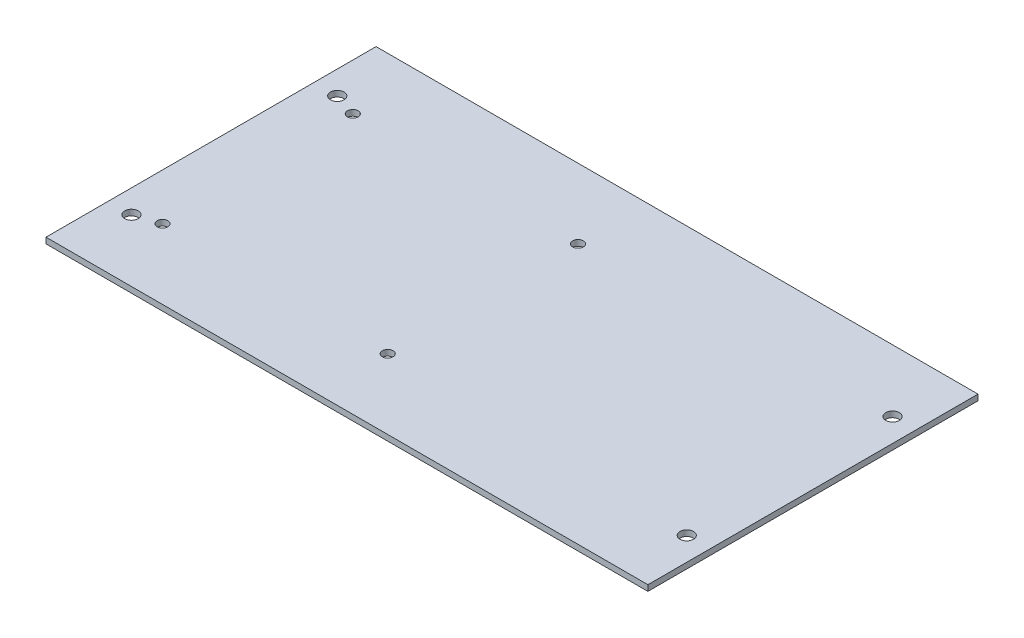
ISO-10303-21;
HEADER;
FILE_DESCRIPTION(('STEP AP214'),'2;1');
FILE_NAME('part.step','',(''),(''),'','','');
FILE_SCHEMA(('AUTOMOTIVE_DESIGN { 1 0 10303 214 1 1 1 1 }'));
ENDSEC;
DATA;
#1=APPLICATION_CONTEXT('core data for automotive mechanical design processes');
#2=APPLICATION_PROTOCOL_DEFINITION('international standard','automotive_design',2000,#1);
#3=PRODUCT_CONTEXT('',#1,'mechanical');
#4=PRODUCT('Part','Part','',(#3));
#5=PRODUCT_RELATED_PRODUCT_CATEGORY('part','',(#4));
#6=PRODUCT_DEFINITION_FORMATION('','',#4);
#7=PRODUCT_DEFINITION_CONTEXT('part definition',#1,'design');
#8=PRODUCT_DEFINITION('design','',#6,#7);
#9=PRODUCT_DEFINITION_SHAPE('','',#8);
#10=(LENGTH_UNIT() NAMED_UNIT(*) SI_UNIT(.MILLI.,.METRE.));
#11=(NAMED_UNIT(*) PLANE_ANGLE_UNIT() SI_UNIT($,.RADIAN.));
#12=(NAMED_UNIT(*) SI_UNIT($,.STERADIAN.) SOLID_ANGLE_UNIT());
#13=UNCERTAINTY_MEASURE_WITH_UNIT(LENGTH_MEASURE(1.E-05),#10,'distance_accuracy_value','');
#14=(GEOMETRIC_REPRESENTATION_CONTEXT(3) GLOBAL_UNCERTAINTY_ASSIGNED_CONTEXT((#13)) GLOBAL_UNIT_ASSIGNED_CONTEXT((#10,
#11,#12)) REPRESENTATION_CONTEXT('',''));
#15=CARTESIAN_POINT('',(0.,0.,0.));
#16=DIRECTION('',(0.,0.,1.));
#17=DIRECTION('',(1.,0.,0.));
#18=AXIS2_PLACEMENT_3D('',#15,#16,#17);
#19=CARTESIAN_POINT('',(-77.5,1.5,42.5));
#20=DIRECTION('',(1.,0.,0.));
#21=DIRECTION('',(0.,0.,-1.));
#22=AXIS2_PLACEMENT_3D('',#19,#20,#21);
#23=PLANE('',#22);
#24=DIRECTION('',(0.,0.,1.));
#25=VECTOR('',#24,1.);
#26=CARTESIAN_POINT('',(-77.5,0.,42.5));
#27=LINE('',#26,#25);
#28=CARTESIAN_POINT('',(-77.5,0.,-42.5));
#29=VERTEX_POINT('',#28);
#30=CARTESIAN_POINT('',(-77.5,0.,42.5));
#31=VERTEX_POINT('',#30);
#32=EDGE_CURVE('E101',#29,#31,#27,.T.);
#33=ORIENTED_EDGE('',*,*,#32,.T.);
#34=DIRECTION('',(0.,-1.,0.));
#35=VECTOR('',#34,1.);
#36=CARTESIAN_POINT('',(-77.5,1.5,42.5));
#37=LINE('',#36,#35);
#38=CARTESIAN_POINT('',(-77.5,1.5,42.5));
#39=VERTEX_POINT('',#38);
#40=EDGE_CURVE('E11',#39,#31,#37,.T.);
#41=ORIENTED_EDGE('',*,*,#40,.F.);
#42=DIRECTION('',(0.,0.,1.));
#43=VECTOR('',#42,1.);
#44=CARTESIAN_POINT('',(-77.5,1.5,42.5));
#45=LINE('',#44,#43);
#46=CARTESIAN_POINT('',(-77.5,1.5,-42.5));
#47=VERTEX_POINT('',#46);
#48=EDGE_CURVE('E88',#47,#39,#45,.T.);
#49=ORIENTED_EDGE('',*,*,#48,.F.);
#50=DIRECTION('',(0.,-1.,0.));
#51=VECTOR('',#50,1.);
#52=CARTESIAN_POINT('',(-77.5,1.5,-42.5));
#53=LINE('',#52,#51);
#54=EDGE_CURVE('E97',#47,#29,#53,.T.);
#55=ORIENTED_EDGE('',*,*,#54,.T.);
#56=EDGE_LOOP('',(#33,#41,#49,#55));
#57=FACE_BOUND('',#56,.T.);
#58=ADVANCED_FACE('F35',(#57),#23,.F.);
#59=CARTESIAN_POINT('',(77.5,1.5,42.5));
#60=DIRECTION('',(0.,0.,-1.));
#61=DIRECTION('',(-1.,0.,0.));
#62=AXIS2_PLACEMENT_3D('',#59,#60,#61);
#63=PLANE('',#62);
#64=DIRECTION('',(1.,0.,0.));
#65=VECTOR('',#64,1.);
#66=CARTESIAN_POINT('',(77.5,0.,42.5));
#67=LINE('',#66,#65);
#68=CARTESIAN_POINT('',(77.5,0.,42.5));
#69=VERTEX_POINT('',#68);
#70=EDGE_CURVE('E92',#31,#69,#67,.T.);
#71=ORIENTED_EDGE('',*,*,#70,.T.);
#72=DIRECTION('',(0.,-1.,0.));
#73=VECTOR('',#72,1.);
#74=CARTESIAN_POINT('',(77.5,1.5,42.5));
#75=LINE('',#74,#73);
#76=CARTESIAN_POINT('',(77.5,1.5,42.5));
#77=VERTEX_POINT('',#76);
#78=EDGE_CURVE('E44',#77,#69,#75,.T.);
#79=ORIENTED_EDGE('',*,*,#78,.F.);
#80=DIRECTION('',(1.,0.,0.));
#81=VECTOR('',#80,1.);
#82=CARTESIAN_POINT('',(77.5,1.5,42.5));
#83=LINE('',#82,#81);
#84=EDGE_CURVE('E83',#39,#77,#83,.T.);
#85=ORIENTED_EDGE('',*,*,#84,.F.);
#86=ORIENTED_EDGE('',*,*,#40,.T.);
#87=EDGE_LOOP('',(#71,#79,#85,#86));
#88=FACE_BOUND('',#87,.T.);
#89=ADVANCED_FACE('F91',(#88),#63,.F.);
#90=CARTESIAN_POINT('',(77.5,1.5,42.5));
#91=DIRECTION('',(-1.,0.,0.));
#92=DIRECTION('',(0.,0.,1.));
#93=AXIS2_PLACEMENT_3D('',#90,#91,#92);
#94=PLANE('',#93);
#95=DIRECTION('',(0.,0.,-1.));
#96=VECTOR('',#95,1.);
#97=CARTESIAN_POINT('',(77.5,0.,42.5));
#98=LINE('',#97,#96);
#99=CARTESIAN_POINT('',(77.5,0.,-42.5));
#100=VERTEX_POINT('',#99);
#101=EDGE_CURVE('E70',#69,#100,#98,.T.);
#102=ORIENTED_EDGE('',*,*,#101,.T.);
#103=DIRECTION('',(0.,-1.,0.));
#104=VECTOR('',#103,1.);
#105=CARTESIAN_POINT('',(77.5,1.5,-42.5));
#106=LINE('',#105,#104);
#107=CARTESIAN_POINT('',(77.5,1.5,-42.5));
#108=VERTEX_POINT('',#107);
#109=EDGE_CURVE('E93',#108,#100,#106,.T.);
#110=ORIENTED_EDGE('',*,*,#109,.F.);
#111=DIRECTION('',(0.,0.,-1.));
#112=VECTOR('',#111,1.);
#113=CARTESIAN_POINT('',(77.5,1.5,42.5));
#114=LINE('',#113,#112);
#115=EDGE_CURVE('E86',#77,#108,#114,.T.);
#116=ORIENTED_EDGE('',*,*,#115,.F.);
#117=ORIENTED_EDGE('',*,*,#78,.T.);
#118=EDGE_LOOP('',(#102,#110,#116,#117));
#119=FACE_BOUND('',#118,.T.);
#120=ADVANCED_FACE('F95',(#119),#94,.F.);
#121=CARTESIAN_POINT('',(77.5,1.5,-42.5));
#122=DIRECTION('',(0.,0.,1.));
#123=DIRECTION('',(1.,0.,0.));
#124=AXIS2_PLACEMENT_3D('',#121,#122,#123);
#125=PLANE('',#124);
#126=DIRECTION('',(-1.,0.,0.));
#127=VECTOR('',#126,1.);
#128=CARTESIAN_POINT('',(77.5,0.,-42.5));
#129=LINE('',#128,#127);
#130=EDGE_CURVE('E76',#100,#29,#129,.T.);
#131=ORIENTED_EDGE('',*,*,#130,.T.);
#132=ORIENTED_EDGE('',*,*,#54,.F.);
#133=DIRECTION('',(-1.,0.,0.));
#134=VECTOR('',#133,1.);
#135=CARTESIAN_POINT('',(77.5,1.5,-42.5));
#136=LINE('',#135,#134);
#137=EDGE_CURVE('E53',#108,#47,#136,.T.);
#138=ORIENTED_EDGE('',*,*,#137,.F.);
#139=ORIENTED_EDGE('',*,*,#109,.T.);
#140=EDGE_LOOP('',(#131,#132,#138,#139));
#141=FACE_BOUND('',#140,.T.);
#142=ADVANCED_FACE('F162',(#141),#125,.F.);
#143=CARTESIAN_POINT('',(0.,1.5,0.));
#144=DIRECTION('',(0.,1.,0.));
#145=DIRECTION('',(0.,0.,1.));
#146=AXIS2_PLACEMENT_3D('',#143,#144,#145);
#147=PLANE('',#146);
#148=CARTESIAN_POINT('',(-7.5,1.5,24.5));
#149=DIRECTION('',(0.,1.,0.));
#150=DIRECTION('',(0.,0.,1.));
#151=AXIS2_PLACEMENT_3D('',#148,#149,#150);
#152=CIRCLE('',#151,1.375);
#153=CARTESIAN_POINT('',(-7.5,1.5,25.875));
#154=VERTEX_POINT('',#153);
#155=EDGE_CURVE('E130',#154,#154,#152,.T.);
#156=ORIENTED_EDGE('',*,*,#155,.F.);
#157=EDGE_LOOP('',(#156));
#158=FACE_BOUND('',#157,.T.);
#159=CARTESIAN_POINT('',(-7.50000000000001,1.5,-24.5));
#160=DIRECTION('',(0.,1.,0.));
#161=DIRECTION('',(0.,0.,1.));
#162=AXIS2_PLACEMENT_3D('',#159,#160,#161);
#163=CIRCLE('',#162,1.375);
#164=CARTESIAN_POINT('',(-7.50000000000001,1.5,-23.125));
#165=VERTEX_POINT('',#164);
#166=EDGE_CURVE('E120',#165,#165,#163,.T.);
#167=ORIENTED_EDGE('',*,*,#166,.F.);
#168=EDGE_LOOP('',(#167));
#169=FACE_BOUND('',#168,.T.);
#170=CARTESIAN_POINT('',(-65.5,1.5,24.5));
#171=DIRECTION('',(0.,1.,0.));
#172=DIRECTION('',(0.,0.,1.));
#173=AXIS2_PLACEMENT_3D('',#170,#171,#172);
#174=CIRCLE('',#173,1.375);
#175=CARTESIAN_POINT('',(-65.5,1.5,25.875));
#176=VERTEX_POINT('',#175);
#177=EDGE_CURVE('E117',#176,#176,#174,.T.);
#178=ORIENTED_EDGE('',*,*,#177,.F.);
#179=EDGE_LOOP('',(#178));
#180=FACE_BOUND('',#179,.T.);
#181=CARTESIAN_POINT('',(-65.5,1.5,-24.5));
#182=DIRECTION('',(0.,1.,0.));
#183=DIRECTION('',(0.,0.,1.));
#184=AXIS2_PLACEMENT_3D('',#181,#182,#183);
#185=CIRCLE('',#184,1.375);
#186=CARTESIAN_POINT('',(-65.5,1.5,-23.125));
#187=VERTEX_POINT('',#186);
#188=EDGE_CURVE('E114',#187,#187,#185,.T.);
#189=ORIENTED_EDGE('',*,*,#188,.F.);
#190=EDGE_LOOP('',(#189));
#191=FACE_BOUND('',#190,.T.);
#192=CARTESIAN_POINT('',(71.5,1.5,-26.5));
#193=DIRECTION('',(0.,1.,0.));
#194=DIRECTION('',(0.,0.,1.));
#195=AXIS2_PLACEMENT_3D('',#192,#193,#194);
#196=CIRCLE('',#195,1.75);
#197=CARTESIAN_POINT('',(71.5,1.5,-24.75));
#198=VERTEX_POINT('',#197);
#199=EDGE_CURVE('E113',#198,#198,#196,.T.);
#200=ORIENTED_EDGE('',*,*,#199,.F.);
#201=EDGE_LOOP('',(#200));
#202=FACE_BOUND('',#201,.T.);
#203=CARTESIAN_POINT('',(71.5,1.5,26.5));
#204=DIRECTION('',(0.,1.,0.));
#205=DIRECTION('',(0.,0.,1.));
#206=AXIS2_PLACEMENT_3D('',#203,#204,#205);
#207=CIRCLE('',#206,1.75);
#208=CARTESIAN_POINT('',(71.5,1.5,28.25));
#209=VERTEX_POINT('',#208);
#210=EDGE_CURVE('E138',#209,#209,#207,.T.);
#211=ORIENTED_EDGE('',*,*,#210,.F.);
#212=EDGE_LOOP('',(#211));
#213=FACE_BOUND('',#212,.T.);
#214=CARTESIAN_POINT('',(-71.5,1.5,26.5));
#215=DIRECTION('',(0.,1.,0.));
#216=DIRECTION('',(0.,0.,1.));
#217=AXIS2_PLACEMENT_3D('',#214,#215,#216);
#218=CIRCLE('',#217,1.75);
#219=CARTESIAN_POINT('',(-71.5,1.5,28.25));
#220=VERTEX_POINT('',#219);
#221=EDGE_CURVE('E144',#220,#220,#218,.T.);
#222=ORIENTED_EDGE('',*,*,#221,.F.);
#223=EDGE_LOOP('',(#222));
#224=FACE_BOUND('',#223,.T.);
#225=CARTESIAN_POINT('',(-71.5,1.5,-26.5));
#226=DIRECTION('',(0.,1.,0.));
#227=DIRECTION('',(0.,0.,1.));
#228=AXIS2_PLACEMENT_3D('',#225,#226,#227);
#229=CIRCLE('',#228,1.75);
#230=CARTESIAN_POINT('',(-71.5,1.5,-24.75));
#231=VERTEX_POINT('',#230);
#232=EDGE_CURVE('E150',#231,#231,#229,.T.);
#233=ORIENTED_EDGE('',*,*,#232,.F.);
#234=EDGE_LOOP('',(#233));
#235=FACE_BOUND('',#234,.T.);
#236=ORIENTED_EDGE('',*,*,#48,.T.);
#237=ORIENTED_EDGE('',*,*,#84,.T.);
#238=ORIENTED_EDGE('',*,*,#115,.T.);
#239=ORIENTED_EDGE('',*,*,#137,.T.);
#240=EDGE_LOOP('',(#236,#237,#238,#239));
#241=FACE_BOUND('',#240,.T.);
#242=ADVANCED_FACE('F84',(#158,#169,#180,#191,#202,#213,#224,#235,#241),#147,.T.);
#243=CARTESIAN_POINT('',(0.,0.,0.));
#244=DIRECTION('',(0.,1.,0.));
#245=DIRECTION('',(0.,0.,1.));
#246=AXIS2_PLACEMENT_3D('',#243,#244,#245);
#247=PLANE('',#246);
#248=CARTESIAN_POINT('',(-7.5,0.,24.5));
#249=DIRECTION('',(0.,1.,0.));
#250=DIRECTION('',(0.,0.,1.));
#251=AXIS2_PLACEMENT_3D('',#248,#249,#250);
#252=CIRCLE('',#251,1.375);
#253=CARTESIAN_POINT('',(-7.5,0.,25.875));
#254=VERTEX_POINT('',#253);
#255=EDGE_CURVE('E38',#254,#254,#252,.T.);
#256=ORIENTED_EDGE('',*,*,#255,.T.);
#257=EDGE_LOOP('',(#256));
#258=FACE_BOUND('',#257,.T.);
#259=CARTESIAN_POINT('',(-7.50000000000001,0.,-24.5));
#260=DIRECTION('',(0.,1.,0.));
#261=DIRECTION('',(0.,0.,1.));
#262=AXIS2_PLACEMENT_3D('',#259,#260,#261);
#263=CIRCLE('',#262,1.375);
#264=CARTESIAN_POINT('',(-7.50000000000001,0.,-23.125));
#265=VERTEX_POINT('',#264);
#266=EDGE_CURVE('E118',#265,#265,#263,.T.);
#267=ORIENTED_EDGE('',*,*,#266,.T.);
#268=EDGE_LOOP('',(#267));
#269=FACE_BOUND('',#268,.T.);
#270=CARTESIAN_POINT('',(-65.5,0.,24.5));
#271=DIRECTION('',(0.,1.,0.));
#272=DIRECTION('',(0.,0.,1.));
#273=AXIS2_PLACEMENT_3D('',#270,#271,#272);
#274=CIRCLE('',#273,1.375);
#275=CARTESIAN_POINT('',(-65.5,0.,25.875));
#276=VERTEX_POINT('',#275);
#277=EDGE_CURVE('E115',#276,#276,#274,.T.);
#278=ORIENTED_EDGE('',*,*,#277,.T.);
#279=EDGE_LOOP('',(#278));
#280=FACE_BOUND('',#279,.T.);
#281=CARTESIAN_POINT('',(-65.5,0.,-24.5));
#282=DIRECTION('',(0.,1.,0.));
#283=DIRECTION('',(0.,0.,1.));
#284=AXIS2_PLACEMENT_3D('',#281,#282,#283);
#285=CIRCLE('',#284,1.375);
#286=CARTESIAN_POINT('',(-65.5,0.,-23.125));
#287=VERTEX_POINT('',#286);
#288=EDGE_CURVE('E110',#287,#287,#285,.T.);
#289=ORIENTED_EDGE('',*,*,#288,.T.);
#290=EDGE_LOOP('',(#289));
#291=FACE_BOUND('',#290,.T.);
#292=CARTESIAN_POINT('',(71.5,0.,-26.5));
#293=DIRECTION('',(0.,1.,0.));
#294=DIRECTION('',(0.,0.,1.));
#295=AXIS2_PLACEMENT_3D('',#292,#293,#294);
#296=CIRCLE('',#295,1.75);
#297=CARTESIAN_POINT('',(71.5,0.,-24.75));
#298=VERTEX_POINT('',#297);
#299=EDGE_CURVE('E135',#298,#298,#296,.T.);
#300=ORIENTED_EDGE('',*,*,#299,.T.);
#301=EDGE_LOOP('',(#300));
#302=FACE_BOUND('',#301,.T.);
#303=CARTESIAN_POINT('',(71.5,0.,26.5));
#304=DIRECTION('',(0.,1.,0.));
#305=DIRECTION('',(0.,0.,1.));
#306=AXIS2_PLACEMENT_3D('',#303,#304,#305);
#307=CIRCLE('',#306,1.75);
#308=CARTESIAN_POINT('',(71.5,0.,28.25));
#309=VERTEX_POINT('',#308);
#310=EDGE_CURVE('E141',#309,#309,#307,.T.);
#311=ORIENTED_EDGE('',*,*,#310,.T.);
#312=EDGE_LOOP('',(#311));
#313=FACE_BOUND('',#312,.T.);
#314=CARTESIAN_POINT('',(-71.5,0.,26.5));
#315=DIRECTION('',(0.,1.,0.));
#316=DIRECTION('',(0.,0.,1.));
#317=AXIS2_PLACEMENT_3D('',#314,#315,#316);
#318=CIRCLE('',#317,1.75);
#319=CARTESIAN_POINT('',(-71.5,0.,28.25));
#320=VERTEX_POINT('',#319);
#321=EDGE_CURVE('E147',#320,#320,#318,.T.);
#322=ORIENTED_EDGE('',*,*,#321,.T.);
#323=EDGE_LOOP('',(#322));
#324=FACE_BOUND('',#323,.T.);
#325=CARTESIAN_POINT('',(-71.5,0.,-26.5));
#326=DIRECTION('',(0.,1.,0.));
#327=DIRECTION('',(0.,0.,1.));
#328=AXIS2_PLACEMENT_3D('',#325,#326,#327);
#329=CIRCLE('',#328,1.75);
#330=CARTESIAN_POINT('',(-71.5,0.,-24.75));
#331=VERTEX_POINT('',#330);
#332=EDGE_CURVE('E104',#331,#331,#329,.T.);
#333=ORIENTED_EDGE('',*,*,#332,.T.);
#334=EDGE_LOOP('',(#333));
#335=FACE_BOUND('',#334,.T.);
#336=ORIENTED_EDGE('',*,*,#32,.F.);
#337=ORIENTED_EDGE('',*,*,#130,.F.);
#338=ORIENTED_EDGE('',*,*,#101,.F.);
#339=ORIENTED_EDGE('',*,*,#70,.F.);
#340=EDGE_LOOP('',(#336,#337,#338,#339));
#341=FACE_BOUND('',#340,.T.);
#342=ADVANCED_FACE('F161',(#258,#269,#280,#291,#302,#313,#324,#335,#341),#247,.F.);
#343=CARTESIAN_POINT('',(-71.5,0.,-26.5));
#344=DIRECTION('',(0.,1.,0.));
#345=DIRECTION('',(0.,0.,1.));
#346=AXIS2_PLACEMENT_3D('',#343,#344,#345);
#347=CYLINDRICAL_SURFACE('',#346,1.75);
#348=ORIENTED_EDGE('',*,*,#332,.F.);
#349=EDGE_LOOP('',(#348));
#350=FACE_BOUND('',#349,.T.);
#351=ORIENTED_EDGE('',*,*,#232,.T.);
#352=EDGE_LOOP('',(#351));
#353=FACE_BOUND('',#352,.T.);
#354=ADVANCED_FACE('F158',(#350,#353),#347,.F.);
#355=CARTESIAN_POINT('',(-71.5,0.,26.5));
#356=DIRECTION('',(0.,1.,0.));
#357=DIRECTION('',(0.,0.,1.));
#358=AXIS2_PLACEMENT_3D('',#355,#356,#357);
#359=CYLINDRICAL_SURFACE('',#358,1.75);
#360=ORIENTED_EDGE('',*,*,#321,.F.);
#361=EDGE_LOOP('',(#360));
#362=FACE_BOUND('',#361,.T.);
#363=ORIENTED_EDGE('',*,*,#221,.T.);
#364=EDGE_LOOP('',(#363));
#365=FACE_BOUND('',#364,.T.);
#366=ADVANCED_FACE('F211',(#362,#365),#359,.F.);
#367=CARTESIAN_POINT('',(71.5,0.,26.5));
#368=DIRECTION('',(0.,1.,0.));
#369=DIRECTION('',(0.,0.,1.));
#370=AXIS2_PLACEMENT_3D('',#367,#368,#369);
#371=CYLINDRICAL_SURFACE('',#370,1.75);
#372=ORIENTED_EDGE('',*,*,#310,.F.);
#373=EDGE_LOOP('',(#372));
#374=FACE_BOUND('',#373,.T.);
#375=ORIENTED_EDGE('',*,*,#210,.T.);
#376=EDGE_LOOP('',(#375));
#377=FACE_BOUND('',#376,.T.);
#378=ADVANCED_FACE('F217',(#374,#377),#371,.F.);
#379=CARTESIAN_POINT('',(71.5,0.,-26.5));
#380=DIRECTION('',(0.,1.,0.));
#381=DIRECTION('',(0.,0.,1.));
#382=AXIS2_PLACEMENT_3D('',#379,#380,#381);
#383=CYLINDRICAL_SURFACE('',#382,1.75);
#384=ORIENTED_EDGE('',*,*,#299,.F.);
#385=EDGE_LOOP('',(#384));
#386=FACE_BOUND('',#385,.T.);
#387=ORIENTED_EDGE('',*,*,#199,.T.);
#388=EDGE_LOOP('',(#387));
#389=FACE_BOUND('',#388,.T.);
#390=ADVANCED_FACE('F225',(#386,#389),#383,.F.);
#391=CARTESIAN_POINT('',(-65.5,-8.5,-24.5));
#392=DIRECTION('',(0.,1.,0.));
#393=DIRECTION('',(0.,0.,1.));
#394=AXIS2_PLACEMENT_3D('',#391,#392,#393);
#395=CYLINDRICAL_SURFACE('',#394,1.375);
#396=ORIENTED_EDGE('',*,*,#188,.T.);
#397=EDGE_LOOP('',(#396));
#398=FACE_BOUND('',#397,.T.);
#399=ORIENTED_EDGE('',*,*,#288,.F.);
#400=EDGE_LOOP('',(#399));
#401=FACE_BOUND('',#400,.T.);
#402=ADVANCED_FACE('F232',(#398,#401),#395,.F.);
#403=CARTESIAN_POINT('',(-65.5,-8.5,24.5));
#404=DIRECTION('',(0.,1.,0.));
#405=DIRECTION('',(0.,0.,1.));
#406=AXIS2_PLACEMENT_3D('',#403,#404,#405);
#407=CYLINDRICAL_SURFACE('',#406,1.375);
#408=ORIENTED_EDGE('',*,*,#177,.T.);
#409=EDGE_LOOP('',(#408));
#410=FACE_BOUND('',#409,.T.);
#411=ORIENTED_EDGE('',*,*,#277,.F.);
#412=EDGE_LOOP('',(#411));
#413=FACE_BOUND('',#412,.T.);
#414=ADVANCED_FACE('F239',(#410,#413),#407,.F.);
#415=CARTESIAN_POINT('',(-7.50000000000001,-8.5,-24.5));
#416=DIRECTION('',(0.,1.,0.));
#417=DIRECTION('',(0.,0.,1.));
#418=AXIS2_PLACEMENT_3D('',#415,#416,#417);
#419=CYLINDRICAL_SURFACE('',#418,1.375);
#420=ORIENTED_EDGE('',*,*,#166,.T.);
#421=EDGE_LOOP('',(#420));
#422=FACE_BOUND('',#421,.T.);
#423=ORIENTED_EDGE('',*,*,#266,.F.);
#424=EDGE_LOOP('',(#423));
#425=FACE_BOUND('',#424,.T.);
#426=ADVANCED_FACE('F247',(#422,#425),#419,.F.);
#427=CARTESIAN_POINT('',(-7.5,-8.5,24.5));
#428=DIRECTION('',(0.,1.,0.));
#429=DIRECTION('',(0.,0.,1.));
#430=AXIS2_PLACEMENT_3D('',#427,#428,#429);
#431=CYLINDRICAL_SURFACE('',#430,1.375);
#432=ORIENTED_EDGE('',*,*,#155,.T.);
#433=EDGE_LOOP('',(#432));
#434=FACE_BOUND('',#433,.T.);
#435=ORIENTED_EDGE('',*,*,#255,.F.);
#436=EDGE_LOOP('',(#435));
#437=FACE_BOUND('',#436,.T.);
#438=ADVANCED_FACE('F255',(#434,#437),#431,.F.);
#439=CLOSED_SHELL('',(#58,#89,#120,#142,#242,#342,#354,#366,#378,#390,#402,#414,#426,#438));
#440=MANIFOLD_SOLID_BREP('B2',#439);
#441=ADVANCED_BREP_SHAPE_REPRESENTATION('',(#18,#440),#14);
#442=SHAPE_DEFINITION_REPRESENTATION(#9,#441);
ENDSEC;
END-ISO-10303-21;
